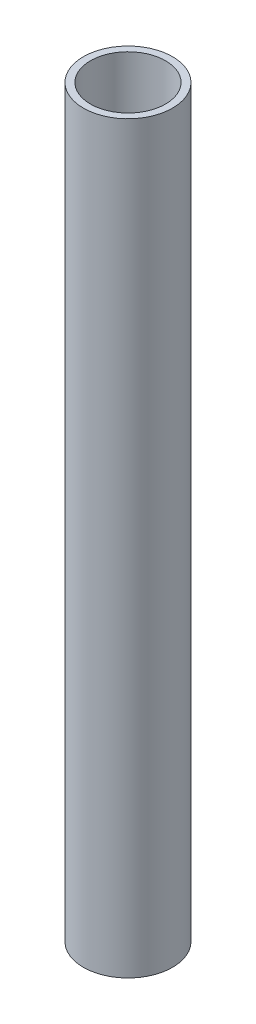
ISO-10303-21;
HEADER;
FILE_DESCRIPTION(('STEP AP214'),'2;1');
FILE_NAME('part.step','',(''),(''),'','','');
FILE_SCHEMA(('AUTOMOTIVE_DESIGN { 1 0 10303 214 1 1 1 1 }'));
ENDSEC;
DATA;
#1=APPLICATION_CONTEXT('core data for automotive mechanical design processes');
#2=APPLICATION_PROTOCOL_DEFINITION('international standard','automotive_design',2000,#1);
#3=PRODUCT_CONTEXT('',#1,'mechanical');
#4=PRODUCT('Part','Part','',(#3));
#5=PRODUCT_RELATED_PRODUCT_CATEGORY('part','',(#4));
#6=PRODUCT_DEFINITION_FORMATION('','',#4);
#7=PRODUCT_DEFINITION_CONTEXT('part definition',#1,'design');
#8=PRODUCT_DEFINITION('design','',#6,#7);
#9=PRODUCT_DEFINITION_SHAPE('','',#8);
#10=(LENGTH_UNIT() NAMED_UNIT(*) SI_UNIT(.MILLI.,.METRE.));
#11=(NAMED_UNIT(*) PLANE_ANGLE_UNIT() SI_UNIT($,.RADIAN.));
#12=(NAMED_UNIT(*) SI_UNIT($,.STERADIAN.) SOLID_ANGLE_UNIT());
#13=UNCERTAINTY_MEASURE_WITH_UNIT(LENGTH_MEASURE(1.E-05),#10,'distance_accuracy_value','');
#14=(GEOMETRIC_REPRESENTATION_CONTEXT(3) GLOBAL_UNCERTAINTY_ASSIGNED_CONTEXT((#13)) GLOBAL_UNIT_ASSIGNED_CONTEXT((#10,
#11,#12)) REPRESENTATION_CONTEXT('',''));
#15=CARTESIAN_POINT('',(0.,0.,0.));
#16=DIRECTION('',(0.,0.,1.));
#17=DIRECTION('',(1.,0.,0.));
#18=AXIS2_PLACEMENT_3D('',#15,#16,#17);
#19=CARTESIAN_POINT('',(0.,106.,0.));
#20=DIRECTION('',(0.,1.,0.));
#21=DIRECTION('',(0.,0.,1.));
#22=AXIS2_PLACEMENT_3D('',#19,#20,#21);
#23=PLANE('',#22);
#24=CARTESIAN_POINT('',(0.,106.,0.));
#25=DIRECTION('',(0.,1.,0.));
#26=DIRECTION('',(0.,0.,1.));
#27=AXIS2_PLACEMENT_3D('',#24,#25,#26);
#28=CIRCLE('',#27,6.35);
#29=CARTESIAN_POINT('',(0.,106.,6.35));
#30=VERTEX_POINT('',#29);
#31=EDGE_CURVE('E10',#30,#30,#28,.T.);
#32=ORIENTED_EDGE('',*,*,#31,.T.);
#33=EDGE_LOOP('',(#32));
#34=FACE_BOUND('',#33,.T.);
#35=CARTESIAN_POINT('',(0.,106.,0.));
#36=DIRECTION('',(0.,1.,0.));
#37=DIRECTION('',(0.,0.,1.));
#38=AXIS2_PLACEMENT_3D('',#35,#36,#37);
#39=CIRCLE('',#38,5.35);
#40=CARTESIAN_POINT('',(0.,106.,5.35));
#41=VERTEX_POINT('',#40);
#42=EDGE_CURVE('E52',#41,#41,#39,.T.);
#43=ORIENTED_EDGE('',*,*,#42,.F.);
#44=EDGE_LOOP('',(#43));
#45=FACE_BOUND('',#44,.T.);
#46=ADVANCED_FACE('F39',(#34,#45),#23,.T.);
#47=CARTESIAN_POINT('',(0.,0.,0.));
#48=DIRECTION('',(0.,1.,0.));
#49=DIRECTION('',(0.,0.,1.));
#50=AXIS2_PLACEMENT_3D('',#47,#48,#49);
#51=PLANE('',#50);
#52=CARTESIAN_POINT('',(0.,0.,0.));
#53=DIRECTION('',(0.,1.,0.));
#54=DIRECTION('',(0.,0.,1.));
#55=AXIS2_PLACEMENT_3D('',#52,#53,#54);
#56=CIRCLE('',#55,6.35);
#57=CARTESIAN_POINT('',(0.,0.,6.35));
#58=VERTEX_POINT('',#57);
#59=EDGE_CURVE('E43',#58,#58,#56,.T.);
#60=ORIENTED_EDGE('',*,*,#59,.F.);
#61=EDGE_LOOP('',(#60));
#62=FACE_BOUND('',#61,.T.);
#63=CARTESIAN_POINT('',(0.,0.,0.));
#64=DIRECTION('',(0.,1.,0.));
#65=DIRECTION('',(0.,0.,1.));
#66=AXIS2_PLACEMENT_3D('',#63,#64,#65);
#67=CIRCLE('',#66,5.35);
#68=CARTESIAN_POINT('',(0.,0.,5.35));
#69=VERTEX_POINT('',#68);
#70=EDGE_CURVE('E54',#69,#69,#67,.T.);
#71=ORIENTED_EDGE('',*,*,#70,.T.);
#72=EDGE_LOOP('',(#71));
#73=FACE_BOUND('',#72,.T.);
#74=ADVANCED_FACE('F66',(#62,#73),#51,.F.);
#75=CARTESIAN_POINT('',(0.,106.,0.));
#76=DIRECTION('',(0.,-1.,0.));
#77=DIRECTION('',(0.,0.,-1.));
#78=AXIS2_PLACEMENT_3D('',#75,#76,#77);
#79=CYLINDRICAL_SURFACE('',#78,6.35);
#80=ORIENTED_EDGE('',*,*,#31,.F.);
#81=EDGE_LOOP('',(#80));
#82=FACE_BOUND('',#81,.T.);
#83=ORIENTED_EDGE('',*,*,#59,.T.);
#84=EDGE_LOOP('',(#83));
#85=FACE_BOUND('',#84,.T.);
#86=ADVANCED_FACE('F41',(#82,#85),#79,.T.);
#87=CARTESIAN_POINT('',(0.,106.,0.));
#88=DIRECTION('',(0.,-1.,0.));
#89=DIRECTION('',(0.,0.,-1.));
#90=AXIS2_PLACEMENT_3D('',#87,#88,#89);
#91=CYLINDRICAL_SURFACE('',#90,5.35);
#92=ORIENTED_EDGE('',*,*,#42,.T.);
#93=EDGE_LOOP('',(#92));
#94=FACE_BOUND('',#93,.T.);
#95=ORIENTED_EDGE('',*,*,#70,.F.);
#96=EDGE_LOOP('',(#95));
#97=FACE_BOUND('',#96,.T.);
#98=ADVANCED_FACE('F62',(#94,#97),#91,.F.);
#99=CLOSED_SHELL('',(#46,#74,#86,#98));
#100=MANIFOLD_SOLID_BREP('B2',#99);
#101=ADVANCED_BREP_SHAPE_REPRESENTATION('',(#18,#100),#14);
#102=SHAPE_DEFINITION_REPRESENTATION(#9,#101);
ENDSEC;
END-ISO-10303-21;
